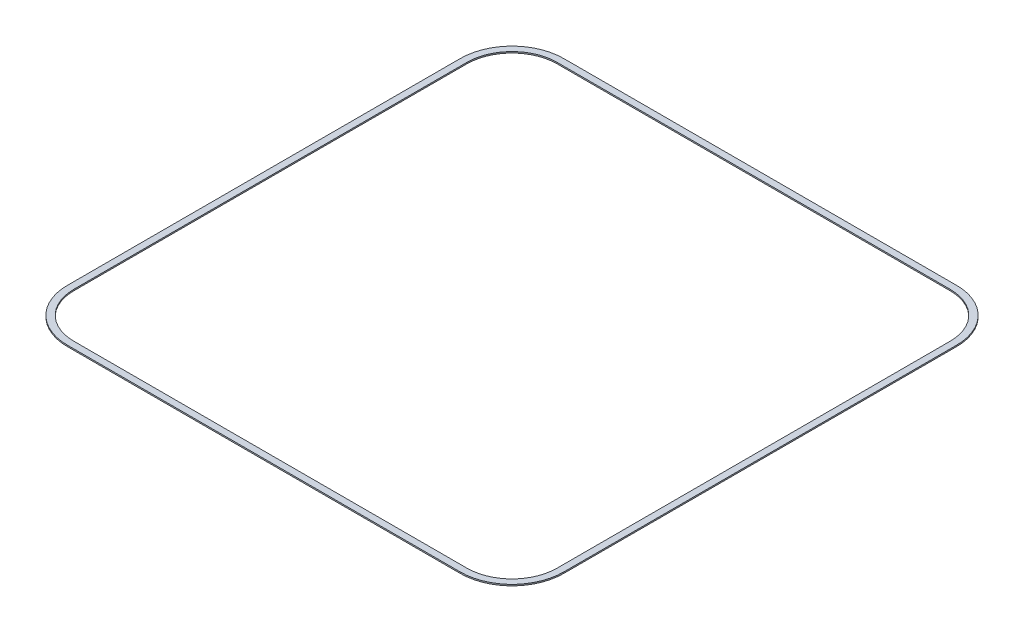
ISO-10303-21;
HEADER;
FILE_DESCRIPTION(('STEP AP214'),'2;1');
FILE_NAME('part.step','',(''),(''),'','','');
FILE_SCHEMA(('AUTOMOTIVE_DESIGN { 1 0 10303 214 1 1 1 1 }'));
ENDSEC;
DATA;
#1=APPLICATION_CONTEXT('core data for automotive mechanical design processes');
#2=APPLICATION_PROTOCOL_DEFINITION('international standard','automotive_design',2000,#1);
#3=PRODUCT_CONTEXT('',#1,'mechanical');
#4=PRODUCT('Part','Part','',(#3));
#5=PRODUCT_RELATED_PRODUCT_CATEGORY('part','',(#4));
#6=PRODUCT_DEFINITION_FORMATION('','',#4);
#7=PRODUCT_DEFINITION_CONTEXT('part definition',#1,'design');
#8=PRODUCT_DEFINITION('design','',#6,#7);
#9=PRODUCT_DEFINITION_SHAPE('','',#8);
#10=(LENGTH_UNIT() NAMED_UNIT(*) SI_UNIT(.MILLI.,.METRE.));
#11=(NAMED_UNIT(*) PLANE_ANGLE_UNIT() SI_UNIT($,.RADIAN.));
#12=(NAMED_UNIT(*) SI_UNIT($,.STERADIAN.) SOLID_ANGLE_UNIT());
#13=UNCERTAINTY_MEASURE_WITH_UNIT(LENGTH_MEASURE(1.E-05),#10,'distance_accuracy_value','');
#14=(GEOMETRIC_REPRESENTATION_CONTEXT(3) GLOBAL_UNCERTAINTY_ASSIGNED_CONTEXT((#13)) GLOBAL_UNIT_ASSIGNED_CONTEXT((#10,
#11,#12)) REPRESENTATION_CONTEXT('',''));
#15=CARTESIAN_POINT('',(0.,0.,0.));
#16=DIRECTION('',(0.,0.,1.));
#17=DIRECTION('',(1.,0.,0.));
#18=AXIS2_PLACEMENT_3D('',#15,#16,#17);
#19=CARTESIAN_POINT('',(-148.5,1.,-148.5));
#20=DIRECTION('',(0.,1.,0.));
#21=DIRECTION('',(0.,0.,1.));
#22=AXIS2_PLACEMENT_3D('',#19,#20,#21);
#23=PLANE('',#22);
#24=CARTESIAN_POINT('',(-148.5,1.,-148.5));
#25=DIRECTION('',(0.,1.,0.));
#26=DIRECTION('',(0.,0.,1.));
#27=AXIS2_PLACEMENT_3D('',#24,#25,#26);
#28=CIRCLE('',#27,39.);
#29=CARTESIAN_POINT('',(-148.5,1.,-187.5));
#30=VERTEX_POINT('',#29);
#31=CARTESIAN_POINT('',(-187.5,1.,-148.5));
#32=VERTEX_POINT('',#31);
#33=EDGE_CURVE('E211',#30,#32,#28,.T.);
#34=ORIENTED_EDGE('',*,*,#33,.T.);
#35=DIRECTION('',(0.,0.,1.));
#36=VECTOR('',#35,1.);
#37=CARTESIAN_POINT('',(-187.5,1.,-148.5));
#38=LINE('',#37,#36);
#39=CARTESIAN_POINT('',(-187.5,1.,148.5));
#40=VERTEX_POINT('',#39);
#41=EDGE_CURVE('E214',#32,#40,#38,.T.);
#42=ORIENTED_EDGE('',*,*,#41,.T.);
#43=CARTESIAN_POINT('',(-148.5,1.,148.5));
#44=DIRECTION('',(0.,1.,0.));
#45=DIRECTION('',(0.,0.,-1.));
#46=AXIS2_PLACEMENT_3D('',#43,#44,#45);
#47=CIRCLE('',#46,39.);
#48=CARTESIAN_POINT('',(-148.5,1.,187.5));
#49=VERTEX_POINT('',#48);
#50=EDGE_CURVE('E217',#40,#49,#47,.T.);
#51=ORIENTED_EDGE('',*,*,#50,.T.);
#52=DIRECTION('',(1.,0.,0.));
#53=VECTOR('',#52,1.);
#54=CARTESIAN_POINT('',(148.5,1.,187.5));
#55=LINE('',#54,#53);
#56=CARTESIAN_POINT('',(148.5,1.,187.5));
#57=VERTEX_POINT('',#56);
#58=EDGE_CURVE('E219',#49,#57,#55,.T.);
#59=ORIENTED_EDGE('',*,*,#58,.T.);
#60=CARTESIAN_POINT('',(148.5,1.,148.5));
#61=DIRECTION('',(0.,1.,0.));
#62=DIRECTION('',(0.,0.,1.));
#63=AXIS2_PLACEMENT_3D('',#60,#61,#62);
#64=CIRCLE('',#63,39.);
#65=CARTESIAN_POINT('',(187.5,1.,148.5));
#66=VERTEX_POINT('',#65);
#67=EDGE_CURVE('E221',#57,#66,#64,.T.);
#68=ORIENTED_EDGE('',*,*,#67,.T.);
#69=DIRECTION('',(0.,0.,-1.));
#70=VECTOR('',#69,1.);
#71=CARTESIAN_POINT('',(187.5,1.,-148.5));
#72=LINE('',#71,#70);
#73=CARTESIAN_POINT('',(187.5,1.,-148.5));
#74=VERTEX_POINT('',#73);
#75=EDGE_CURVE('E223',#66,#74,#72,.T.);
#76=ORIENTED_EDGE('',*,*,#75,.T.);
#77=CARTESIAN_POINT('',(148.5,1.,-148.5));
#78=DIRECTION('',(0.,1.,0.));
#79=DIRECTION('',(0.,0.,-1.));
#80=AXIS2_PLACEMENT_3D('',#77,#78,#79);
#81=CIRCLE('',#80,39.);
#82=CARTESIAN_POINT('',(148.5,1.,-187.5));
#83=VERTEX_POINT('',#82);
#84=EDGE_CURVE('E225',#74,#83,#81,.T.);
#85=ORIENTED_EDGE('',*,*,#84,.T.);
#86=DIRECTION('',(-1.,0.,0.));
#87=VECTOR('',#86,1.);
#88=CARTESIAN_POINT('',(148.5,1.,-187.5));
#89=LINE('',#88,#87);
#90=EDGE_CURVE('E227',#83,#30,#89,.T.);
#91=ORIENTED_EDGE('',*,*,#90,.T.);
#92=EDGE_LOOP('',(#34,#42,#51,#59,#68,#76,#85,#91));
#93=FACE_BOUND('',#92,.T.);
#94=DIRECTION('',(0.,0.,1.));
#95=VECTOR('',#94,1.);
#96=CARTESIAN_POINT('',(-182.5,1.,-148.5));
#97=LINE('',#96,#95);
#98=CARTESIAN_POINT('',(-182.5,1.,-148.5));
#99=VERTEX_POINT('',#98);
#100=CARTESIAN_POINT('',(-182.5,1.,148.5));
#101=VERTEX_POINT('',#100);
#102=EDGE_CURVE('E154',#99,#101,#97,.T.);
#103=ORIENTED_EDGE('',*,*,#102,.F.);
#104=CARTESIAN_POINT('',(-148.5,1.,-148.5));
#105=DIRECTION('',(0.,1.,0.));
#106=DIRECTION('',(0.,0.,1.));
#107=AXIS2_PLACEMENT_3D('',#104,#105,#106);
#108=CIRCLE('',#107,34.);
#109=CARTESIAN_POINT('',(-148.5,1.,-182.5));
#110=VERTEX_POINT('',#109);
#111=EDGE_CURVE('E146',#110,#99,#108,.T.);
#112=ORIENTED_EDGE('',*,*,#111,.F.);
#113=DIRECTION('',(-1.,0.,0.));
#114=VECTOR('',#113,1.);
#115=CARTESIAN_POINT('',(-148.5,1.,-182.5));
#116=LINE('',#115,#114);
#117=CARTESIAN_POINT('',(148.5,1.,-182.5));
#118=VERTEX_POINT('',#117);
#119=EDGE_CURVE('E179',#118,#110,#116,.T.);
#120=ORIENTED_EDGE('',*,*,#119,.F.);
#121=CARTESIAN_POINT('',(148.5,1.,-148.5));
#122=DIRECTION('',(0.,1.,0.));
#123=DIRECTION('',(0.,0.,-1.));
#124=AXIS2_PLACEMENT_3D('',#121,#122,#123);
#125=CIRCLE('',#124,34.);
#126=CARTESIAN_POINT('',(182.5,1.,-148.5));
#127=VERTEX_POINT('',#126);
#128=EDGE_CURVE('E177',#127,#118,#125,.T.);
#129=ORIENTED_EDGE('',*,*,#128,.F.);
#130=DIRECTION('',(0.,0.,-1.));
#131=VECTOR('',#130,1.);
#132=CARTESIAN_POINT('',(182.5,1.,-148.5));
#133=LINE('',#132,#131);
#134=CARTESIAN_POINT('',(182.5,1.,148.5));
#135=VERTEX_POINT('',#134);
#136=EDGE_CURVE('E175',#135,#127,#133,.T.);
#137=ORIENTED_EDGE('',*,*,#136,.F.);
#138=CARTESIAN_POINT('',(148.5,1.,148.5));
#139=DIRECTION('',(0.,1.,0.));
#140=DIRECTION('',(0.,0.,-1.));
#141=AXIS2_PLACEMENT_3D('',#138,#139,#140);
#142=CIRCLE('',#141,34.);
#143=CARTESIAN_POINT('',(148.5,1.,182.5));
#144=VERTEX_POINT('',#143);
#145=EDGE_CURVE('E173',#144,#135,#142,.T.);
#146=ORIENTED_EDGE('',*,*,#145,.F.);
#147=DIRECTION('',(1.,0.,0.));
#148=VECTOR('',#147,1.);
#149=CARTESIAN_POINT('',(-148.5,1.,182.5));
#150=LINE('',#149,#148);
#151=CARTESIAN_POINT('',(-148.5,1.,182.5));
#152=VERTEX_POINT('',#151);
#153=EDGE_CURVE('E169',#152,#144,#150,.T.);
#154=ORIENTED_EDGE('',*,*,#153,.F.);
#155=CARTESIAN_POINT('',(-148.5,1.,148.5));
#156=DIRECTION('',(0.,1.,0.));
#157=DIRECTION('',(0.,0.,-1.));
#158=AXIS2_PLACEMENT_3D('',#155,#156,#157);
#159=CIRCLE('',#158,34.);
#160=EDGE_CURVE('E167',#101,#152,#159,.T.);
#161=ORIENTED_EDGE('',*,*,#160,.F.);
#162=EDGE_LOOP('',(#103,#112,#120,#129,#137,#146,#154,#161));
#163=FACE_BOUND('',#162,.T.);
#164=ADVANCED_FACE('F33',(#93,#163),#23,.T.);
#165=CARTESIAN_POINT('',(-148.5,0.,-148.5));
#166=DIRECTION('',(0.,1.,0.));
#167=DIRECTION('',(0.,0.,1.));
#168=AXIS2_PLACEMENT_3D('',#165,#166,#167);
#169=PLANE('',#168);
#170=CARTESIAN_POINT('',(-148.5,0.,-148.5));
#171=DIRECTION('',(0.,1.,0.));
#172=DIRECTION('',(0.,0.,1.));
#173=AXIS2_PLACEMENT_3D('',#170,#171,#172);
#174=CIRCLE('',#173,39.);
#175=CARTESIAN_POINT('',(-148.5,0.,-187.5));
#176=VERTEX_POINT('',#175);
#177=CARTESIAN_POINT('',(-187.5,0.,-148.5));
#178=VERTEX_POINT('',#177);
#179=EDGE_CURVE('E162',#176,#178,#174,.T.);
#180=ORIENTED_EDGE('',*,*,#179,.F.);
#181=DIRECTION('',(-1.,0.,0.));
#182=VECTOR('',#181,1.);
#183=CARTESIAN_POINT('',(148.5,0.,-187.5));
#184=LINE('',#183,#182);
#185=CARTESIAN_POINT('',(148.5,0.,-187.5));
#186=VERTEX_POINT('',#185);
#187=EDGE_CURVE('E215',#186,#176,#184,.T.);
#188=ORIENTED_EDGE('',*,*,#187,.F.);
#189=CARTESIAN_POINT('',(148.5,0.,-148.5));
#190=DIRECTION('',(0.,1.,0.));
#191=DIRECTION('',(0.,0.,-1.));
#192=AXIS2_PLACEMENT_3D('',#189,#190,#191);
#193=CIRCLE('',#192,39.);
#194=CARTESIAN_POINT('',(187.5,0.,-148.5));
#195=VERTEX_POINT('',#194);
#196=EDGE_CURVE('E242',#195,#186,#193,.T.);
#197=ORIENTED_EDGE('',*,*,#196,.F.);
#198=DIRECTION('',(0.,0.,-1.));
#199=VECTOR('',#198,1.);
#200=CARTESIAN_POINT('',(187.5,0.,-148.5));
#201=LINE('',#200,#199);
#202=CARTESIAN_POINT('',(187.5,0.,148.5));
#203=VERTEX_POINT('',#202);
#204=EDGE_CURVE('E240',#203,#195,#201,.T.);
#205=ORIENTED_EDGE('',*,*,#204,.F.);
#206=CARTESIAN_POINT('',(148.5,0.,148.5));
#207=DIRECTION('',(0.,1.,0.));
#208=DIRECTION('',(0.,0.,1.));
#209=AXIS2_PLACEMENT_3D('',#206,#207,#208);
#210=CIRCLE('',#209,39.);
#211=CARTESIAN_POINT('',(148.5,0.,187.5));
#212=VERTEX_POINT('',#211);
#213=EDGE_CURVE('E238',#212,#203,#210,.T.);
#214=ORIENTED_EDGE('',*,*,#213,.F.);
#215=DIRECTION('',(1.,0.,0.));
#216=VECTOR('',#215,1.);
#217=CARTESIAN_POINT('',(148.5,0.,187.5));
#218=LINE('',#217,#216);
#219=CARTESIAN_POINT('',(-148.5,0.,187.5));
#220=VERTEX_POINT('',#219);
#221=EDGE_CURVE('E236',#220,#212,#218,.T.);
#222=ORIENTED_EDGE('',*,*,#221,.F.);
#223=CARTESIAN_POINT('',(-148.5,0.,148.5));
#224=DIRECTION('',(0.,1.,0.));
#225=DIRECTION('',(0.,0.,-1.));
#226=AXIS2_PLACEMENT_3D('',#223,#224,#225);
#227=CIRCLE('',#226,39.);
#228=CARTESIAN_POINT('',(-187.5,0.,148.5));
#229=VERTEX_POINT('',#228);
#230=EDGE_CURVE('E234',#229,#220,#227,.T.);
#231=ORIENTED_EDGE('',*,*,#230,.F.);
#232=DIRECTION('',(0.,0.,1.));
#233=VECTOR('',#232,1.);
#234=CARTESIAN_POINT('',(-187.5,0.,-148.5));
#235=LINE('',#234,#233);
#236=EDGE_CURVE('E232',#178,#229,#235,.T.);
#237=ORIENTED_EDGE('',*,*,#236,.F.);
#238=EDGE_LOOP('',(#180,#188,#197,#205,#214,#222,#231,#237));
#239=FACE_BOUND('',#238,.T.);
#240=CARTESIAN_POINT('',(-148.5,0.,-148.5));
#241=DIRECTION('',(0.,1.,0.));
#242=DIRECTION('',(0.,0.,1.));
#243=AXIS2_PLACEMENT_3D('',#240,#241,#242);
#244=CIRCLE('',#243,34.);
#245=CARTESIAN_POINT('',(-148.5,0.,-182.5));
#246=VERTEX_POINT('',#245);
#247=CARTESIAN_POINT('',(-182.5,0.,-148.5));
#248=VERTEX_POINT('',#247);
#249=EDGE_CURVE('E56',#246,#248,#244,.T.);
#250=ORIENTED_EDGE('',*,*,#249,.T.);
#251=DIRECTION('',(0.,0.,1.));
#252=VECTOR('',#251,1.);
#253=CARTESIAN_POINT('',(-182.5,0.,-148.5));
#254=LINE('',#253,#252);
#255=CARTESIAN_POINT('',(-182.5,0.,148.5));
#256=VERTEX_POINT('',#255);
#257=EDGE_CURVE('E161',#248,#256,#254,.T.);
#258=ORIENTED_EDGE('',*,*,#257,.T.);
#259=CARTESIAN_POINT('',(-148.5,0.,148.5));
#260=DIRECTION('',(0.,1.,0.));
#261=DIRECTION('',(0.,0.,-1.));
#262=AXIS2_PLACEMENT_3D('',#259,#260,#261);
#263=CIRCLE('',#262,34.);
#264=CARTESIAN_POINT('',(-148.5,0.,182.5));
#265=VERTEX_POINT('',#264);
#266=EDGE_CURVE('E183',#256,#265,#263,.T.);
#267=ORIENTED_EDGE('',*,*,#266,.T.);
#268=DIRECTION('',(1.,0.,0.));
#269=VECTOR('',#268,1.);
#270=CARTESIAN_POINT('',(-148.5,0.,182.5));
#271=LINE('',#270,#269);
#272=CARTESIAN_POINT('',(148.5,0.,182.5));
#273=VERTEX_POINT('',#272);
#274=EDGE_CURVE('E186',#265,#273,#271,.T.);
#275=ORIENTED_EDGE('',*,*,#274,.T.);
#276=CARTESIAN_POINT('',(148.5,0.,148.5));
#277=DIRECTION('',(0.,1.,0.));
#278=DIRECTION('',(0.,0.,-1.));
#279=AXIS2_PLACEMENT_3D('',#276,#277,#278);
#280=CIRCLE('',#279,34.);
#281=CARTESIAN_POINT('',(182.5,0.,148.5));
#282=VERTEX_POINT('',#281);
#283=EDGE_CURVE('E189',#273,#282,#280,.T.);
#284=ORIENTED_EDGE('',*,*,#283,.T.);
#285=DIRECTION('',(0.,0.,-1.));
#286=VECTOR('',#285,1.);
#287=CARTESIAN_POINT('',(182.5,0.,-148.5));
#288=LINE('',#287,#286);
#289=CARTESIAN_POINT('',(182.5,0.,-148.5));
#290=VERTEX_POINT('',#289);
#291=EDGE_CURVE('E192',#282,#290,#288,.T.);
#292=ORIENTED_EDGE('',*,*,#291,.T.);
#293=CARTESIAN_POINT('',(148.5,0.,-148.5));
#294=DIRECTION('',(0.,1.,0.));
#295=DIRECTION('',(0.,0.,-1.));
#296=AXIS2_PLACEMENT_3D('',#293,#294,#295);
#297=CIRCLE('',#296,34.);
#298=CARTESIAN_POINT('',(148.5,0.,-182.5));
#299=VERTEX_POINT('',#298);
#300=EDGE_CURVE('E195',#290,#299,#297,.T.);
#301=ORIENTED_EDGE('',*,*,#300,.T.);
#302=DIRECTION('',(-1.,0.,0.));
#303=VECTOR('',#302,1.);
#304=CARTESIAN_POINT('',(-148.5,0.,-182.5));
#305=LINE('',#304,#303);
#306=EDGE_CURVE('E155',#299,#246,#305,.T.);
#307=ORIENTED_EDGE('',*,*,#306,.T.);
#308=EDGE_LOOP('',(#250,#258,#267,#275,#284,#292,#301,#307));
#309=FACE_BOUND('',#308,.T.);
#310=ADVANCED_FACE('F272',(#239,#309),#169,.F.);
#311=CARTESIAN_POINT('',(-148.5,1.,-148.5));
#312=DIRECTION('',(0.,-1.,0.));
#313=DIRECTION('',(0.,0.,-1.));
#314=AXIS2_PLACEMENT_3D('',#311,#312,#313);
#315=CYLINDRICAL_SURFACE('',#314,39.);
#316=ORIENTED_EDGE('',*,*,#179,.T.);
#317=DIRECTION('',(0.,-1.,0.));
#318=VECTOR('',#317,1.);
#319=CARTESIAN_POINT('',(-187.5,1.,-148.5));
#320=LINE('',#319,#318);
#321=EDGE_CURVE('E11',#32,#178,#320,.T.);
#322=ORIENTED_EDGE('',*,*,#321,.F.);
#323=ORIENTED_EDGE('',*,*,#33,.F.);
#324=DIRECTION('',(0.,-1.,0.));
#325=VECTOR('',#324,1.);
#326=CARTESIAN_POINT('',(-148.5,1.,-187.5));
#327=LINE('',#326,#325);
#328=EDGE_CURVE('E229',#30,#176,#327,.T.);
#329=ORIENTED_EDGE('',*,*,#328,.T.);
#330=EDGE_LOOP('',(#316,#322,#323,#329));
#331=FACE_BOUND('',#330,.T.);
#332=ADVANCED_FACE('F35',(#331),#315,.T.);
#333=CARTESIAN_POINT('',(-187.5,1.,-148.5));
#334=DIRECTION('',(1.,0.,0.));
#335=DIRECTION('',(0.,0.,-1.));
#336=AXIS2_PLACEMENT_3D('',#333,#334,#335);
#337=PLANE('',#336);
#338=ORIENTED_EDGE('',*,*,#236,.T.);
#339=DIRECTION('',(0.,-1.,0.));
#340=VECTOR('',#339,1.);
#341=CARTESIAN_POINT('',(-187.5,1.,148.5));
#342=LINE('',#341,#340);
#343=EDGE_CURVE('E41',#40,#229,#342,.T.);
#344=ORIENTED_EDGE('',*,*,#343,.F.);
#345=ORIENTED_EDGE('',*,*,#41,.F.);
#346=ORIENTED_EDGE('',*,*,#321,.T.);
#347=EDGE_LOOP('',(#338,#344,#345,#346));
#348=FACE_BOUND('',#347,.T.);
#349=ADVANCED_FACE('F289',(#348),#337,.F.);
#350=CARTESIAN_POINT('',(-148.5,1.,148.5));
#351=DIRECTION('',(0.,-1.,0.));
#352=DIRECTION('',(0.,0.,-1.));
#353=AXIS2_PLACEMENT_3D('',#350,#351,#352);
#354=CYLINDRICAL_SURFACE('',#353,39.);
#355=ORIENTED_EDGE('',*,*,#230,.T.);
#356=DIRECTION('',(0.,-1.,0.));
#357=VECTOR('',#356,1.);
#358=CARTESIAN_POINT('',(-148.5,1.,187.5));
#359=LINE('',#358,#357);
#360=EDGE_CURVE('E259',#49,#220,#359,.T.);
#361=ORIENTED_EDGE('',*,*,#360,.F.);
#362=ORIENTED_EDGE('',*,*,#50,.F.);
#363=ORIENTED_EDGE('',*,*,#343,.T.);
#364=EDGE_LOOP('',(#355,#361,#362,#363));
#365=FACE_BOUND('',#364,.T.);
#366=ADVANCED_FACE('F266',(#365),#354,.T.);
#367=CARTESIAN_POINT('',(148.5,1.,187.5));
#368=DIRECTION('',(0.,0.,-1.));
#369=DIRECTION('',(-1.,0.,0.));
#370=AXIS2_PLACEMENT_3D('',#367,#368,#369);
#371=PLANE('',#370);
#372=ORIENTED_EDGE('',*,*,#221,.T.);
#373=DIRECTION('',(0.,-1.,0.));
#374=VECTOR('',#373,1.);
#375=CARTESIAN_POINT('',(148.5,1.,187.5));
#376=LINE('',#375,#374);
#377=EDGE_CURVE('E256',#57,#212,#376,.T.);
#378=ORIENTED_EDGE('',*,*,#377,.F.);
#379=ORIENTED_EDGE('',*,*,#58,.F.);
#380=ORIENTED_EDGE('',*,*,#360,.T.);
#381=EDGE_LOOP('',(#372,#378,#379,#380));
#382=FACE_BOUND('',#381,.T.);
#383=ADVANCED_FACE('F278',(#382),#371,.F.);
#384=CARTESIAN_POINT('',(148.5,1.,148.5));
#385=DIRECTION('',(0.,-1.,0.));
#386=DIRECTION('',(0.,0.,-1.));
#387=AXIS2_PLACEMENT_3D('',#384,#385,#386);
#388=CYLINDRICAL_SURFACE('',#387,39.);
#389=ORIENTED_EDGE('',*,*,#213,.T.);
#390=DIRECTION('',(0.,-1.,0.));
#391=VECTOR('',#390,1.);
#392=CARTESIAN_POINT('',(187.5,1.,148.5));
#393=LINE('',#392,#391);
#394=EDGE_CURVE('E253',#66,#203,#393,.T.);
#395=ORIENTED_EDGE('',*,*,#394,.F.);
#396=ORIENTED_EDGE('',*,*,#67,.F.);
#397=ORIENTED_EDGE('',*,*,#377,.T.);
#398=EDGE_LOOP('',(#389,#395,#396,#397));
#399=FACE_BOUND('',#398,.T.);
#400=ADVANCED_FACE('F282',(#399),#388,.T.);
#401=CARTESIAN_POINT('',(187.5,1.,-148.5));
#402=DIRECTION('',(-1.,0.,0.));
#403=DIRECTION('',(0.,0.,1.));
#404=AXIS2_PLACEMENT_3D('',#401,#402,#403);
#405=PLANE('',#404);
#406=ORIENTED_EDGE('',*,*,#204,.T.);
#407=DIRECTION('',(0.,-1.,0.));
#408=VECTOR('',#407,1.);
#409=CARTESIAN_POINT('',(187.5,1.,-148.5));
#410=LINE('',#409,#408);
#411=EDGE_CURVE('E250',#74,#195,#410,.T.);
#412=ORIENTED_EDGE('',*,*,#411,.F.);
#413=ORIENTED_EDGE('',*,*,#75,.F.);
#414=ORIENTED_EDGE('',*,*,#394,.T.);
#415=EDGE_LOOP('',(#406,#412,#413,#414));
#416=FACE_BOUND('',#415,.T.);
#417=ADVANCED_FACE('F302',(#416),#405,.F.);
#418=CARTESIAN_POINT('',(148.5,1.,-148.5));
#419=DIRECTION('',(0.,-1.,0.));
#420=DIRECTION('',(0.,0.,-1.));
#421=AXIS2_PLACEMENT_3D('',#418,#419,#420);
#422=CYLINDRICAL_SURFACE('',#421,39.);
#423=ORIENTED_EDGE('',*,*,#196,.T.);
#424=DIRECTION('',(0.,-1.,0.));
#425=VECTOR('',#424,1.);
#426=CARTESIAN_POINT('',(148.5,1.,-187.5));
#427=LINE('',#426,#425);
#428=EDGE_CURVE('E247',#83,#186,#427,.T.);
#429=ORIENTED_EDGE('',*,*,#428,.F.);
#430=ORIENTED_EDGE('',*,*,#84,.F.);
#431=ORIENTED_EDGE('',*,*,#411,.T.);
#432=EDGE_LOOP('',(#423,#429,#430,#431));
#433=FACE_BOUND('',#432,.T.);
#434=ADVANCED_FACE('F300',(#433),#422,.T.);
#435=CARTESIAN_POINT('',(148.5,1.,-187.5));
#436=DIRECTION('',(0.,0.,1.));
#437=DIRECTION('',(1.,0.,0.));
#438=AXIS2_PLACEMENT_3D('',#435,#436,#437);
#439=PLANE('',#438);
#440=ORIENTED_EDGE('',*,*,#187,.T.);
#441=ORIENTED_EDGE('',*,*,#328,.F.);
#442=ORIENTED_EDGE('',*,*,#90,.F.);
#443=ORIENTED_EDGE('',*,*,#428,.T.);
#444=EDGE_LOOP('',(#440,#441,#442,#443));
#445=FACE_BOUND('',#444,.T.);
#446=ADVANCED_FACE('F295',(#445),#439,.F.);
#447=CARTESIAN_POINT('',(-148.5,1.,-148.5));
#448=DIRECTION('',(0.,-1.,0.));
#449=DIRECTION('',(0.,0.,-1.));
#450=AXIS2_PLACEMENT_3D('',#447,#448,#449);
#451=CYLINDRICAL_SURFACE('',#450,34.);
#452=ORIENTED_EDGE('',*,*,#249,.F.);
#453=DIRECTION('',(0.,-1.,0.));
#454=VECTOR('',#453,1.);
#455=CARTESIAN_POINT('',(-148.5,1.,-182.5));
#456=LINE('',#455,#454);
#457=EDGE_CURVE('E150',#110,#246,#456,.T.);
#458=ORIENTED_EDGE('',*,*,#457,.F.);
#459=ORIENTED_EDGE('',*,*,#111,.T.);
#460=DIRECTION('',(0.,-1.,0.));
#461=VECTOR('',#460,1.);
#462=CARTESIAN_POINT('',(-182.5,1.,-148.5));
#463=LINE('',#462,#461);
#464=EDGE_CURVE('E149',#99,#248,#463,.T.);
#465=ORIENTED_EDGE('',*,*,#464,.T.);
#466=EDGE_LOOP('',(#452,#458,#459,#465));
#467=FACE_BOUND('',#466,.T.);
#468=ADVANCED_FACE('F148',(#467),#451,.F.);
#469=CARTESIAN_POINT('',(-182.5,1.,-148.5));
#470=DIRECTION('',(1.,0.,0.));
#471=DIRECTION('',(0.,0.,-1.));
#472=AXIS2_PLACEMENT_3D('',#469,#470,#471);
#473=PLANE('',#472);
#474=ORIENTED_EDGE('',*,*,#257,.F.);
#475=ORIENTED_EDGE('',*,*,#464,.F.);
#476=ORIENTED_EDGE('',*,*,#102,.T.);
#477=DIRECTION('',(0.,-1.,0.));
#478=VECTOR('',#477,1.);
#479=CARTESIAN_POINT('',(-182.5,1.,148.5));
#480=LINE('',#479,#478);
#481=EDGE_CURVE('E163',#101,#256,#480,.T.);
#482=ORIENTED_EDGE('',*,*,#481,.T.);
#483=EDGE_LOOP('',(#474,#475,#476,#482));
#484=FACE_BOUND('',#483,.T.);
#485=ADVANCED_FACE('F158',(#484),#473,.T.);
#486=CARTESIAN_POINT('',(-148.5,1.,148.5));
#487=DIRECTION('',(0.,-1.,0.));
#488=DIRECTION('',(0.,0.,-1.));
#489=AXIS2_PLACEMENT_3D('',#486,#487,#488);
#490=CYLINDRICAL_SURFACE('',#489,34.);
#491=ORIENTED_EDGE('',*,*,#266,.F.);
#492=ORIENTED_EDGE('',*,*,#481,.F.);
#493=ORIENTED_EDGE('',*,*,#160,.T.);
#494=DIRECTION('',(0.,-1.,0.));
#495=VECTOR('',#494,1.);
#496=CARTESIAN_POINT('',(-148.5,1.,182.5));
#497=LINE('',#496,#495);
#498=EDGE_CURVE('E208',#152,#265,#497,.T.);
#499=ORIENTED_EDGE('',*,*,#498,.T.);
#500=EDGE_LOOP('',(#491,#492,#493,#499));
#501=FACE_BOUND('',#500,.T.);
#502=ADVANCED_FACE('F327',(#501),#490,.F.);
#503=CARTESIAN_POINT('',(-148.5,1.,182.5));
#504=DIRECTION('',(0.,0.,-1.));
#505=DIRECTION('',(-1.,0.,0.));
#506=AXIS2_PLACEMENT_3D('',#503,#504,#505);
#507=PLANE('',#506);
#508=ORIENTED_EDGE('',*,*,#274,.F.);
#509=ORIENTED_EDGE('',*,*,#498,.F.);
#510=ORIENTED_EDGE('',*,*,#153,.T.);
#511=DIRECTION('',(0.,-1.,0.));
#512=VECTOR('',#511,1.);
#513=CARTESIAN_POINT('',(148.5,1.,182.5));
#514=LINE('',#513,#512);
#515=EDGE_CURVE('E206',#144,#273,#514,.T.);
#516=ORIENTED_EDGE('',*,*,#515,.T.);
#517=EDGE_LOOP('',(#508,#509,#510,#516));
#518=FACE_BOUND('',#517,.T.);
#519=ADVANCED_FACE('F331',(#518),#507,.T.);
#520=CARTESIAN_POINT('',(148.5,1.,148.5));
#521=DIRECTION('',(0.,-1.,0.));
#522=DIRECTION('',(0.,0.,-1.));
#523=AXIS2_PLACEMENT_3D('',#520,#521,#522);
#524=CYLINDRICAL_SURFACE('',#523,34.);
#525=ORIENTED_EDGE('',*,*,#283,.F.);
#526=ORIENTED_EDGE('',*,*,#515,.F.);
#527=ORIENTED_EDGE('',*,*,#145,.T.);
#528=DIRECTION('',(0.,-1.,0.));
#529=VECTOR('',#528,1.);
#530=CARTESIAN_POINT('',(182.5,1.,148.5));
#531=LINE('',#530,#529);
#532=EDGE_CURVE('E204',#135,#282,#531,.T.);
#533=ORIENTED_EDGE('',*,*,#532,.T.);
#534=EDGE_LOOP('',(#525,#526,#527,#533));
#535=FACE_BOUND('',#534,.T.);
#536=ADVANCED_FACE('F337',(#535),#524,.F.);
#537=CARTESIAN_POINT('',(182.5,1.,-148.5));
#538=DIRECTION('',(-1.,0.,0.));
#539=DIRECTION('',(0.,0.,1.));
#540=AXIS2_PLACEMENT_3D('',#537,#538,#539);
#541=PLANE('',#540);
#542=ORIENTED_EDGE('',*,*,#291,.F.);
#543=ORIENTED_EDGE('',*,*,#532,.F.);
#544=ORIENTED_EDGE('',*,*,#136,.T.);
#545=DIRECTION('',(0.,-1.,0.));
#546=VECTOR('',#545,1.);
#547=CARTESIAN_POINT('',(182.5,1.,-148.5));
#548=LINE('',#547,#546);
#549=EDGE_CURVE('E202',#127,#290,#548,.T.);
#550=ORIENTED_EDGE('',*,*,#549,.T.);
#551=EDGE_LOOP('',(#542,#543,#544,#550));
#552=FACE_BOUND('',#551,.T.);
#553=ADVANCED_FACE('F341',(#552),#541,.T.);
#554=CARTESIAN_POINT('',(148.5,1.,-148.5));
#555=DIRECTION('',(0.,-1.,0.));
#556=DIRECTION('',(0.,0.,-1.));
#557=AXIS2_PLACEMENT_3D('',#554,#555,#556);
#558=CYLINDRICAL_SURFACE('',#557,34.);
#559=ORIENTED_EDGE('',*,*,#300,.F.);
#560=ORIENTED_EDGE('',*,*,#549,.F.);
#561=ORIENTED_EDGE('',*,*,#128,.T.);
#562=DIRECTION('',(0.,-1.,0.));
#563=VECTOR('',#562,1.);
#564=CARTESIAN_POINT('',(148.5,1.,-182.5));
#565=LINE('',#564,#563);
#566=EDGE_CURVE('E48',#118,#299,#565,.T.);
#567=ORIENTED_EDGE('',*,*,#566,.T.);
#568=EDGE_LOOP('',(#559,#560,#561,#567));
#569=FACE_BOUND('',#568,.T.);
#570=ADVANCED_FACE('F345',(#569),#558,.F.);
#571=CARTESIAN_POINT('',(-148.5,1.,-182.5));
#572=DIRECTION('',(0.,0.,1.));
#573=DIRECTION('',(1.,0.,0.));
#574=AXIS2_PLACEMENT_3D('',#571,#572,#573);
#575=PLANE('',#574);
#576=ORIENTED_EDGE('',*,*,#306,.F.);
#577=ORIENTED_EDGE('',*,*,#566,.F.);
#578=ORIENTED_EDGE('',*,*,#119,.T.);
#579=ORIENTED_EDGE('',*,*,#457,.T.);
#580=EDGE_LOOP('',(#576,#577,#578,#579));
#581=FACE_BOUND('',#580,.T.);
#582=ADVANCED_FACE('F349',(#581),#575,.T.);
#583=CLOSED_SHELL('',(#164,#310,#332,#349,#366,#383,#400,#417,#434,#446,#468,#485,#502,#519,
#536,#553,#570,#582));
#584=MANIFOLD_SOLID_BREP('B2',#583);
#585=ADVANCED_BREP_SHAPE_REPRESENTATION('',(#18,#584),#14);
#586=SHAPE_DEFINITION_REPRESENTATION(#9,#585);
ENDSEC;
END-ISO-10303-21;
